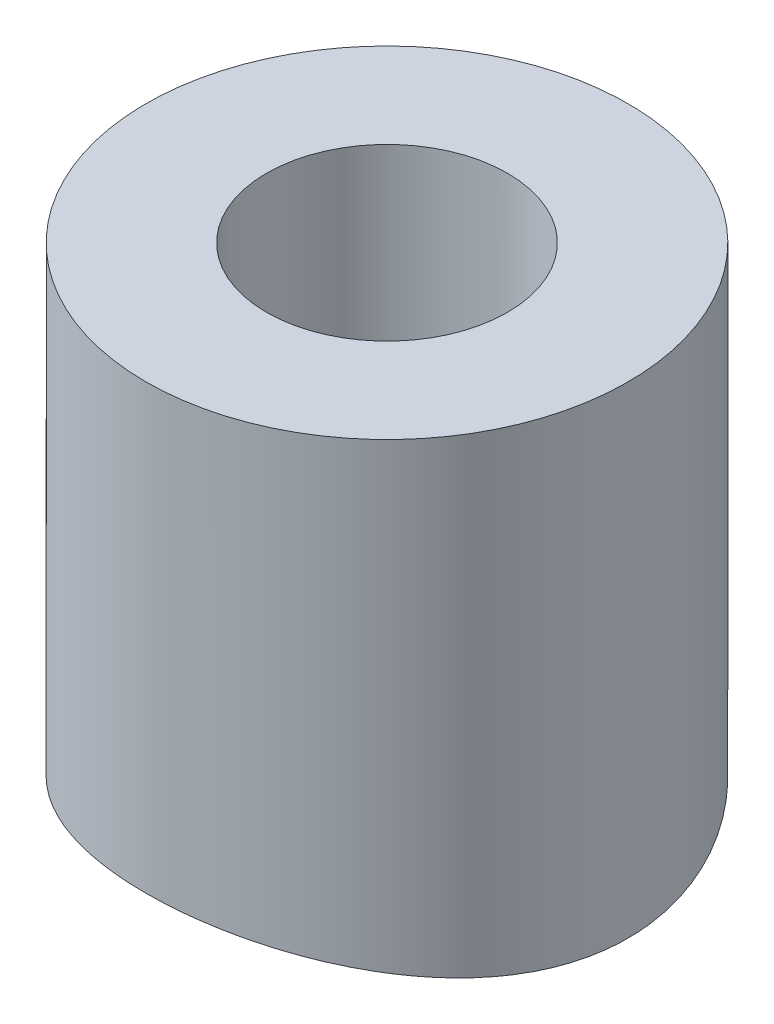
ISO-10303-21;
HEADER;
FILE_DESCRIPTION(('STEP AP214'),'2;1');
FILE_NAME('part.step','',(''),(''),'','','');
FILE_SCHEMA(('AUTOMOTIVE_DESIGN { 1 0 10303 214 1 1 1 1 }'));
ENDSEC;
DATA;
#1=APPLICATION_CONTEXT('core data for automotive mechanical design processes');
#2=APPLICATION_PROTOCOL_DEFINITION('international standard','automotive_design',2000,#1);
#3=PRODUCT_CONTEXT('',#1,'mechanical');
#4=PRODUCT('Part','Part','',(#3));
#5=PRODUCT_RELATED_PRODUCT_CATEGORY('part','',(#4));
#6=PRODUCT_DEFINITION_FORMATION('','',#4);
#7=PRODUCT_DEFINITION_CONTEXT('part definition',#1,'design');
#8=PRODUCT_DEFINITION('design','',#6,#7);
#9=PRODUCT_DEFINITION_SHAPE('','',#8);
#10=(LENGTH_UNIT() NAMED_UNIT(*) SI_UNIT(.MILLI.,.METRE.));
#11=(NAMED_UNIT(*) PLANE_ANGLE_UNIT() SI_UNIT($,.RADIAN.));
#12=(NAMED_UNIT(*) SI_UNIT($,.STERADIAN.) SOLID_ANGLE_UNIT());
#13=UNCERTAINTY_MEASURE_WITH_UNIT(LENGTH_MEASURE(1.E-05),#10,'distance_accuracy_value','');
#14=(GEOMETRIC_REPRESENTATION_CONTEXT(3) GLOBAL_UNCERTAINTY_ASSIGNED_CONTEXT((#13)) GLOBAL_UNIT_ASSIGNED_CONTEXT((#10,
#11,#12)) REPRESENTATION_CONTEXT('',''));
#15=CARTESIAN_POINT('',(0.,0.,0.));
#16=DIRECTION('',(0.,0.,1.));
#17=DIRECTION('',(1.,0.,0.));
#18=AXIS2_PLACEMENT_3D('',#15,#16,#17);
#19=CARTESIAN_POINT('',(0.,-3.,0.));
#20=DIRECTION('',(0.,1.,0.));
#21=DIRECTION('',(0.,0.,1.));
#22=AXIS2_PLACEMENT_3D('',#19,#20,#21);
#23=CYLINDRICAL_SURFACE('',#22,4.);
#24=CARTESIAN_POINT('',(0.,7.35,0.));
#25=DIRECTION('',(0.,1.,0.));
#26=DIRECTION('',(0.,0.,1.));
#27=AXIS2_PLACEMENT_3D('',#24,#25,#26);
#28=CIRCLE('',#27,4.);
#29=CARTESIAN_POINT('',(0.,7.35,4.));
#30=VERTEX_POINT('',#29);
#31=EDGE_CURVE('E10',#30,#30,#28,.T.);
#32=ORIENTED_EDGE('',*,*,#31,.F.);
#33=EDGE_LOOP('',(#32));
#34=FACE_BOUND('',#33,.T.);
#35=CARTESIAN_POINT('',(0.,0.,4.));
#36=CARTESIAN_POINT('',(0.218918765085815,-9.16452249252507E-07,3.99999883290101));
#37=CARTESIAN_POINT('',(0.437850099919964,-0.00571377357667798,3.98196882579684));
#38=CARTESIAN_POINT('',(0.869304947577911,-0.0279434528718654,3.9105178350174));
#39=CARTESIAN_POINT('',(1.08182709174836,-0.0444625658170373,3.85708934733083));
#40=CARTESIAN_POINT('',(1.49417975131561,-0.0865012688560553,3.71682567854202));
#41=CARTESIAN_POINT('',(1.69402952934709,-0.112006792387034,3.6300426885616));
#42=CARTESIAN_POINT('',(2.07634035666149,-0.169388331086235,3.425757119446));
#43=CARTESIAN_POINT('',(2.25879857624387,-0.201265380331954,3.30824955285874));
#44=CARTESIAN_POINT('',(2.60686236037393,-0.269126324037804,3.0419772775887));
#45=CARTESIAN_POINT('',(2.77184690189043,-0.30520073945087,2.89242394728774));
#46=CARTESIAN_POINT('',(3.07485663667347,-0.376869376506891,2.56798425513407));
#47=CARTESIAN_POINT('',(3.21287671002883,-0.412463505762827,2.39309309318759));
#48=CARTESIAN_POINT('',(3.46142726817568,-0.480115595278447,2.01754141247655));
#49=CARTESIAN_POINT('',(3.57117833523169,-0.512061990185142,1.81634304554311));
#50=CARTESIAN_POINT('',(3.75502772185286,-0.567438326328873,1.3971760267923));
#51=CARTESIAN_POINT('',(3.82913560209649,-0.590870550934411,1.17921189032292));
#52=CARTESIAN_POINT('',(3.9373159449026,-0.625617887307541,0.739714864909036));
#53=CARTESIAN_POINT('',(3.97254178880021,-0.637281146336291,0.518494173164566));
#54=CARTESIAN_POINT('',(4.00556174445514,-0.648203225157378,0.0729988768012311));
#55=CARTESIAN_POINT('',(4.00336598848616,-0.64746540266773,-0.151274884735823));
#56=CARTESIAN_POINT('',(3.96250641218262,-0.633975737208477,-0.586935925113309));
#57=CARTESIAN_POINT('',(3.92531317072806,-0.621708384383295,-0.798478662608204));
#58=CARTESIAN_POINT('',(3.81790042743857,-0.587329601545587,-1.21215386865269));
#59=CARTESIAN_POINT('',(3.74767736498699,-0.565217110240291,-1.41428532008273));
#60=CARTESIAN_POINT('',(3.57516868160257,-0.51327129661766,-1.80688466159839));
#61=CARTESIAN_POINT('',(3.47242431738875,-0.483328644008185,-1.99713589201843));
#62=CARTESIAN_POINT('',(3.23810813295372,-0.419145884612471,-2.35817744300989));
#63=CARTESIAN_POINT('',(3.10652872523039,-0.384904647734188,-2.52896262337292));
#64=CARTESIAN_POINT('',(2.81107896109196,-0.31404351208699,-2.85453224645009));
#65=CARTESIAN_POINT('',(2.6459959160956,-0.27738687139624,-3.00821024584686));
#66=CARTESIAN_POINT('',(2.29194575454488,-0.207221659615794,-3.28597215201625));
#67=CARTESIAN_POINT('',(2.10297681387962,-0.173713329296384,-3.41005379649179));
#68=CARTESIAN_POINT('',(1.70436210855202,-0.113258736533207,-3.62586641875897));
#69=CARTESIAN_POINT('',(1.49456256740305,-0.0863672985536468,-3.71732976291819));
#70=CARTESIAN_POINT('',(1.06151079714214,-0.0425723948885827,-3.86333570779228));
#71=CARTESIAN_POINT('',(0.83826274334227,-0.02566584666217,-3.91788970394022));
#72=CARTESIAN_POINT('',(0.394040035670715,-0.00424334182804554,-3.98663493564253));
#73=CARTESIAN_POINT('',(0.173318952240813,0.000732081994964816,-4.0023236983232));
#74=CARTESIAN_POINT('',(-0.267627852724079,-0.000907164529881186,-3.99712039710697));
#75=CARTESIAN_POINT('',(-0.487853643021008,-0.00752011202231954,-3.97623377091213));
#76=CARTESIAN_POINT('',(-0.915757275577583,-0.0312909606112832,-3.89967292292236));
#77=CARTESIAN_POINT('',(-1.12361164821959,-0.0481775956699955,-3.84489300654223));
#78=CARTESIAN_POINT('',(-1.52711825291248,-0.090515411100391,-3.70319489673325));
#79=CARTESIAN_POINT('',(-1.72276896746664,-0.115967654079025,-3.61627271576181));
#80=CARTESIAN_POINT('',(-2.10167282412066,-0.173602873890906,-3.41036750459175));
#81=CARTESIAN_POINT('',(-2.28450220306892,-0.205936119319331,-3.29064789639692));
#82=CARTESIAN_POINT('',(-2.62797665962434,-0.273639497153773,-3.02342776338905));
#83=CARTESIAN_POINT('',(-2.788615609402,-0.309010464063071,-2.87591959131193));
#84=CARTESIAN_POINT('',(-3.08986992532354,-0.380598039176326,-2.55026539366253));
#85=CARTESIAN_POINT('',(-3.22941770628933,-0.416791296741205,-2.37112437549823));
#86=CARTESIAN_POINT('',(-3.47657100068045,-0.484439030741516,-1.99118183363662));
#87=CARTESIAN_POINT('',(-3.58417694532647,-0.51589357114768,-1.79038060240608));
#88=CARTESIAN_POINT('',(-3.76373945096825,-0.570157256846534,-1.37318155133196));
#89=CARTESIAN_POINT('',(-3.83582756303698,-0.592998230178627,-1.15684473776707));
#90=CARTESIAN_POINT('',(-3.94228686876255,-0.627238829760972,-0.714234073909824));
#91=CARTESIAN_POINT('',(-3.97667270899782,-0.638642898872705,-0.48796411799873));
#92=CARTESIAN_POINT('',(-4.00568878741091,-0.648250562294463,-0.0430849003340369));
#93=CARTESIAN_POINT('',(-4.00207268691007,-0.647036471730906,0.175398805002222));
#94=CARTESIAN_POINT('',(-3.95943044370344,-0.632962120675141,0.608481225157764));
#95=CARTESIAN_POINT('',(-3.92040600213323,-0.620102419677213,0.823080126110909));
#96=CARTESIAN_POINT('',(-3.80923682687644,-0.584595885695188,1.23911087945259));
#97=CARTESIAN_POINT('',(-3.73760147980193,-0.562099880977222,1.44069269611642));
#98=CARTESIAN_POINT('',(-3.56364623974347,-0.509896054694601,1.82913631275633));
#99=CARTESIAN_POINT('',(-3.4613200347524,-0.480186749852859,2.01599507473723));
#100=CARTESIAN_POINT('',(-3.22414333539558,-0.41543407035094,2.37771067103791));
#101=CARTESIAN_POINT('',(-3.08816401221122,-0.380225893059815,2.551797743114));
#102=CARTESIAN_POINT('',(-2.78951829579109,-0.309192352008089,2.8752503214997));
#103=CARTESIAN_POINT('',(-2.6268447193199,-0.273366824451644,3.02460915182104));
#104=CARTESIAN_POINT('',(-2.27290045815541,-0.203701390043485,3.29935717836509));
#105=CARTESIAN_POINT('',(-2.08085684024069,-0.169967586307961,3.42378058235905));
#106=CARTESIAN_POINT('',(-1.6775181846494,-0.109630003231463,3.6384157618764));
#107=CARTESIAN_POINT('',(-1.46623045691208,-0.0830235315604699,3.72864046122565));
#108=CARTESIAN_POINT('',(-1.04784816917991,-0.0416977888879065,3.86607762205332));
#109=CARTESIAN_POINT('',(-0.84176876192482,-0.0261982448560713,3.91615204553234));
#110=CARTESIAN_POINT('',(-0.423796008402905,-0.00534997288010206,3.98311031375885));
#111=CARTESIAN_POINT('',(-0.21190389275295,8.87086125589453E-07,4.00000112970132));
#112=CARTESIAN_POINT('',(0.,0.,4.));
#113=B_SPLINE_CURVE_WITH_KNOTS('',3,(#35,#36,#37,#38,#39,#40,#41,#42,#43,#44,#45,#46,#47,#48,
#49,#50,#51,#52,#53,#54,#55,#56,#57,#58,#59,#60,#61,#62,#63,#64,#65,#66,#67,#68,#69,#70,#71,#72,
#73,#74,#75,#76,#77,#78,#79,#80,#81,#82,#83,#84,#85,#86,#87,#88,#89,#90,#91,#92,#93,#94,#95,#96,
#97,#98,#99,#100,#101,#102,#103,#104,#105,#106,#107,#108,#109,#110,#111,#112),.UNSPECIFIED.,.T.,
.F.,(4,2,2,2,2,2,2,2,2,2,2,2,2,2,2,2,2,2,2,2,2,2,2,2,2,2,2,2,2,2,2,2,2,2,2,2,2,2,4),(0.,
0.655977301116014,1.31209370528588,1.96718761034615,2.62238792143084,3.2960812947928,
3.96990246244423,4.66068498238149,5.35128210818027,6.02079190864126,6.6901204354857,
7.33252342965632,7.97499569078435,8.62696795094645,9.27911197410464,9.96143998876912,
10.6438201427715,11.3316769657278,12.0193213219748,12.6800264685678,13.3406333957614,
13.9845120411112,14.6284705923233,15.2882817174656,15.9482746850494,16.6348602174856,
17.3214364804687,18.0054503169092,18.6891983334046,19.3415375870417,19.9938455017705,
20.6362964877099,21.2788796934488,21.9469442210266,22.6151888157477,23.3057249739012,
23.9959999149136,24.6310909944242,25.2660486400585),.UNSPECIFIED.);
#114=CARTESIAN_POINT('',(0.,0.,4.));
#115=VERTEX_POINT('',#114);
#116=EDGE_CURVE('E47',#115,#115,#113,.T.);
#117=ORIENTED_EDGE('',*,*,#116,.T.);
#118=EDGE_LOOP('',(#117));
#119=FACE_BOUND('',#118,.T.);
#120=ADVANCED_FACE('F31',(#34,#119),#23,.T.);
#121=CARTESIAN_POINT('',(0.,-3.,0.));
#122=DIRECTION('',(0.,1.,0.));
#123=DIRECTION('',(0.,0.,1.));
#124=AXIS2_PLACEMENT_3D('',#121,#122,#123);
#125=CYLINDRICAL_SURFACE('',#124,2.);
#126=CARTESIAN_POINT('',(0.,7.35,0.));
#127=DIRECTION('',(0.,1.,0.));
#128=DIRECTION('',(0.,0.,1.));
#129=AXIS2_PLACEMENT_3D('',#126,#127,#128);
#130=CIRCLE('',#129,2.);
#131=CARTESIAN_POINT('',(0.,7.35,2.));
#132=VERTEX_POINT('',#131);
#133=EDGE_CURVE('E43',#132,#132,#130,.T.);
#134=ORIENTED_EDGE('',*,*,#133,.T.);
#135=EDGE_LOOP('',(#134));
#136=FACE_BOUND('',#135,.T.);
#137=CARTESIAN_POINT('',(0.,0.,2.));
#138=CARTESIAN_POINT('',(0.111600664148431,-1.84757718294725E-06,1.99999545104186));
#139=CARTESIAN_POINT('',(0.223264408691944,-0.0014864041759239,1.99062742468302));
#140=CARTESIAN_POINT('',(0.443466081735364,-0.00726568411584606,1.95341497965549));
#141=CARTESIAN_POINT('',(0.552000938104321,-0.0115630773139899,1.92555300675381));
#142=CARTESIAN_POINT('',(0.762726600203343,-0.0224855015054699,1.85220975884927));
#143=CARTESIAN_POINT('',(0.864922301127025,-0.0291087094623656,1.80674228065987));
#144=CARTESIAN_POINT('',(1.06021942005788,-0.043952483209049,1.69951346482873));
#145=CARTESIAN_POINT('',(1.15332200133802,-0.0521728442734976,1.63775421512671));
#146=CARTESIAN_POINT('',(1.32860297056712,-0.069376865500057,1.4991310475032));
#147=CARTESIAN_POINT('',(1.41069206722919,-0.0783658978920528,1.42215488066347));
#148=CARTESIAN_POINT('',(1.56084506439828,-0.0960525015406582,1.25552453918275));
#149=CARTESIAN_POINT('',(1.62890812473979,-0.10475005531146,1.16586960562036));
#150=CARTESIAN_POINT('',(1.74942910866078,-0.12092100036123,0.975820824021005));
#151=CARTESIAN_POINT('',(1.80179980015071,-0.128387448507779,0.875371014880484));
#152=CARTESIAN_POINT('',(1.88889181156734,-0.141176911746356,0.666963393551248));
#153=CARTESIAN_POINT('',(1.9236141931795,-0.146500055771079,0.559006033445395));
#154=CARTESIAN_POINT('',(1.97414485466214,-0.154347083251108,0.339590246175058));
#155=CARTESIAN_POINT('',(1.99010658054076,-0.156893663996593,0.228167983851933));
#156=CARTESIAN_POINT('',(2.00313837228686,-0.15896802551832,0.00419971379784015));
#157=CARTESIAN_POINT('',(2.00020963248389,-0.158495997142923,-0.108346222440844));
#158=CARTESIAN_POINT('',(1.97566884734412,-0.154607215353773,-0.330278151907135));
#159=CARTESIAN_POINT('',(1.9542283431422,-0.151217499866565,-0.4396836561318));
#160=CARTESIAN_POINT('',(1.89354147195399,-0.141917553068231,-0.653324783958595));
#161=CARTESIAN_POINT('',(1.85429455435304,-0.136007243814973,-0.757560247580774));
#162=CARTESIAN_POINT('',(1.75893248532883,-0.122302472896848,-0.958420694950193));
#163=CARTESIAN_POINT('',(1.70274529763056,-0.114499993311939,-1.05501090868438));
#164=CARTESIAN_POINT('',(1.57514886920774,-0.0978957173234849,-1.23745715680302));
#165=CARTESIAN_POINT('',(1.50373852907517,-0.089093848766065,-1.3233124152038));
#166=CARTESIAN_POINT('',(1.34678429864889,-0.0713633653806147,-1.48284529498106));
#167=CARTESIAN_POINT('',(1.2610930547786,-0.0624344241822952,-1.55637798552634));
#168=CARTESIAN_POINT('',(1.07851000708309,-0.045545934883099,-1.6880414560579));
#169=CARTESIAN_POINT('',(0.981618144707528,-0.0375863918501214,-1.74617215552626));
#170=CARTESIAN_POINT('',(0.779253998051944,-0.0235239465156606,-1.84539147348214));
#171=CARTESIAN_POINT('',(0.673775789064684,-0.0174223402187812,-1.88646820319181));
#172=CARTESIAN_POINT('',(0.457300496976723,-0.00777388834913264,-1.95028386535312));
#173=CARTESIAN_POINT('',(0.346303826181981,-0.00422685222011904,-1.9730241656121));
#174=CARTESIAN_POINT('',(0.123192515262891,-0.000112601060143193,-1.99932710050814));
#175=CARTESIAN_POINT('',(0.0111019000102469,0.000485552130124902,-2.00308885804587));
#176=CARTESIAN_POINT('',(-0.212108799245062,-0.00128091445476925,-1.99185747782774));
#177=CARTESIAN_POINT('',(-0.323228916331892,-0.00364543283270842,-1.97686498193488));
#178=CARTESIAN_POINT('',(-0.540735984090567,-0.0110524239712116,-1.92871627982614));
#179=CARTESIAN_POINT('',(-0.647145094524473,-0.0160804883748896,-1.89565777092395));
#180=CARTESIAN_POINT('',(-0.852910537175737,-0.0282528253556291,-1.81241896803047));
#181=CARTESIAN_POINT('',(-0.952266509022134,-0.0353972059667865,-1.76223779993869));
#182=CARTESIAN_POINT('',(-1.14197626986114,-0.051085694636344,-1.6457158330721));
#183=CARTESIAN_POINT('',(-1.23225209209936,-0.0596404935499595,-1.57924956284089));
#184=CARTESIAN_POINT('',(-1.40043925638692,-0.0771661954207304,-1.43221789735206));
#185=CARTESIAN_POINT('',(-1.47834980144401,-0.0861371251510858,-1.35165159399329));
#186=CARTESIAN_POINT('',(-1.62032529447352,-0.103582961017278,-1.17781745709451));
#187=CARTESIAN_POINT('',(-1.68425629390624,-0.112052545531287,-1.08443960718776));
#188=CARTESIAN_POINT('',(-1.79552493875651,-0.127440253993492,-0.888153248137395));
#189=CARTESIAN_POINT('',(-1.84286306759368,-0.134358423138779,-0.785245016764045));
#190=CARTESIAN_POINT('',(-1.91939776922027,-0.145820850239174,-0.573207628536617));
#191=CARTESIAN_POINT('',(-1.94866316332215,-0.150374103172068,-0.464103820605353));
#192=CARTESIAN_POINT('',(-1.98843966512351,-0.156614492290115,-0.242452135121114));
#193=CARTESIAN_POINT('',(-1.99895221290397,-0.158301848554625,-0.129904522702251));
#194=CARTESIAN_POINT('',(-2.00088776475511,-0.158610618476816,0.0941038194385465));
#195=CARTESIAN_POINT('',(-1.99252147376704,-0.157265873264188,0.205562738608512));
#196=CARTESIAN_POINT('',(-1.95739014761224,-0.151735776575692,0.425466724489306));
#197=CARTESIAN_POINT('',(-1.93062515445397,-0.147550431585564,0.533911798080845));
#198=CARTESIAN_POINT('',(-1.8595334344723,-0.136823000664265,0.744641242987672));
#199=CARTESIAN_POINT('',(-1.81522293072758,-0.130283092334958,0.846931205128734));
#200=CARTESIAN_POINT('',(-1.71031923483932,-0.115581016035559,1.04265934283271));
#201=CARTESIAN_POINT('',(-1.6497253785591,-0.107418781900439,1.13609715713953));
#202=CARTESIAN_POINT('',(-1.51321535288378,-0.0902835812530324,1.31253660758065));
#203=CARTESIAN_POINT('',(-1.4371435662029,-0.0813029376731333,1.39541711351072));
#204=CARTESIAN_POINT('',(-1.27216585168972,-0.0636056455146633,1.54730993435494));
#205=CARTESIAN_POINT('',(-1.18325695526795,-0.0548890585649677,1.61631903264325));
#206=CARTESIAN_POINT('',(-0.994487066672457,-0.0386407961823079,1.73889057092499));
#207=CARTESIAN_POINT('',(-0.894562527845793,-0.0311166792268063,1.79235614060556));
#208=CARTESIAN_POINT('',(-0.687076932420277,-0.0181749142967689,1.88166300168163));
#209=CARTESIAN_POINT('',(-0.579523781530769,-0.0127551222182225,1.91752224213883));
#210=CARTESIAN_POINT('',(-0.392929714532194,-0.00584618217026536,1.96261624984703));
#211=CARTESIAN_POINT('',(-0.3150309161386,-0.00366532212491857,1.97661328739818));
#212=CARTESIAN_POINT('',(-0.158098621405055,-0.000741586929009408,1.99530670685025));
#213=CARTESIAN_POINT('',(-0.0790651414330077,1.30894338660775E-06,2.00000322277668));
#214=CARTESIAN_POINT('',(0.,0.,2.));
#215=B_SPLINE_CURVE_WITH_KNOTS('',3,(#137,#138,#139,#140,#141,#142,#143,#144,#145,#146,#147,
#148,#149,#150,#151,#152,#153,#154,#155,#156,#157,#158,#159,#160,#161,#162,#163,#164,#165,#166,
#167,#168,#169,#170,#171,#172,#173,#174,#175,#176,#177,#178,#179,#180,#181,#182,#183,#184,#185,
#186,#187,#188,#189,#190,#191,#192,#193,#194,#195,#196,#197,#198,#199,#200,#201,#202,#203,#204,
#205,#206,#207,#208,#209,#210,#211,#212,#213,#214),.UNSPECIFIED.,.T.,.F.,(4,2,2,2,2,2,2,2,2,2,2,
2,2,2,2,2,2,2,2,2,2,2,2,2,2,2,2,2,2,2,2,2,2,2,2,2,2,2,4),(0.,0.334513039604495,
0.669344049903146,1.00391319427767,1.33843948136658,1.67553227840721,2.0126452615833,
2.35159886049296,2.69053206624813,3.02667336088651,3.36279340355811,3.69583178246362,
4.02888046037267,4.36336585230724,4.69787540878863,5.03607855788055,5.37428347498268,
5.71272376947474,6.05113881565149,6.38599571658059,6.72084115736918,7.05389348767034,
7.38696282261842,7.72268383084116,8.05842646886413,8.39725738316846,8.73607842509268,
9.07360114302579,9.4110979405752,9.74484662182495,10.0785945410525,10.4120345853634,
10.7454882315036,11.0824767022769,11.4195432270249,11.758667468913,12.0974452634267,
12.3344393900488,12.5714301014333),.UNSPECIFIED.);
#216=CARTESIAN_POINT('',(0.,0.,2.));
#217=VERTEX_POINT('',#216);
#218=EDGE_CURVE('E35',#217,#217,#215,.T.);
#219=ORIENTED_EDGE('',*,*,#218,.F.);
#220=EDGE_LOOP('',(#219));
#221=FACE_BOUND('',#220,.T.);
#222=ADVANCED_FACE('F62',(#136,#221),#125,.F.);
#223=CARTESIAN_POINT('',(0.,7.35,0.));
#224=DIRECTION('',(0.,1.,0.));
#225=DIRECTION('',(0.,0.,1.));
#226=AXIS2_PLACEMENT_3D('',#223,#224,#225);
#227=PLANE('',#226);
#228=ORIENTED_EDGE('',*,*,#31,.T.);
#229=EDGE_LOOP('',(#228));
#230=FACE_BOUND('',#229,.T.);
#231=ORIENTED_EDGE('',*,*,#133,.F.);
#232=EDGE_LOOP('',(#231));
#233=FACE_BOUND('',#232,.T.);
#234=ADVANCED_FACE('F58',(#230,#233),#227,.T.);
#235=CARTESIAN_POINT('',(0.,-12.7,13.));
#236=DIRECTION('',(0.,0.,-1.));
#237=DIRECTION('',(-1.,0.,0.));
#238=AXIS2_PLACEMENT_3D('',#235,#236,#237);
#239=CYLINDRICAL_SURFACE('',#238,12.7);
#240=ORIENTED_EDGE('',*,*,#116,.F.);
#241=EDGE_LOOP('',(#240));
#242=FACE_BOUND('',#241,.T.);
#243=ORIENTED_EDGE('',*,*,#218,.T.);
#244=EDGE_LOOP('',(#243));
#245=FACE_BOUND('',#244,.T.);
#246=ADVANCED_FACE('F54',(#242,#245),#239,.F.);
#247=CLOSED_SHELL('',(#120,#222,#234,#246));
#248=MANIFOLD_SOLID_BREP('B2',#247);
#249=ADVANCED_BREP_SHAPE_REPRESENTATION('',(#18,#248),#14);
#250=SHAPE_DEFINITION_REPRESENTATION(#9,#249);
ENDSEC;
END-ISO-10303-21;
